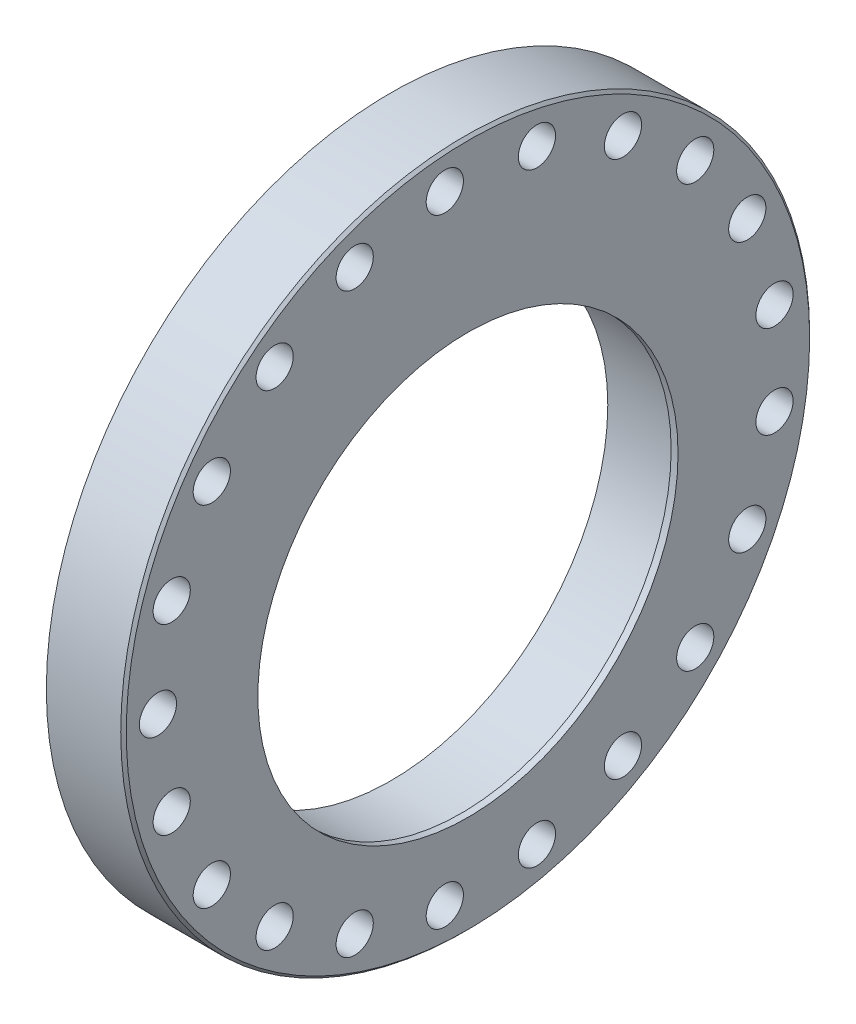
ISO-10303-21;
HEADER;
FILE_DESCRIPTION(('STEP AP214'),'2;1');
FILE_NAME('part.step','',(''),(''),'','','');
FILE_SCHEMA(('AUTOMOTIVE_DESIGN { 1 0 10303 214 1 1 1 1 }'));
ENDSEC;
DATA;
#1=APPLICATION_CONTEXT('core data for automotive mechanical design processes');
#2=APPLICATION_PROTOCOL_DEFINITION('international standard','automotive_design',2000,#1);
#3=PRODUCT_CONTEXT('',#1,'mechanical');
#4=PRODUCT('Part','Part','',(#3));
#5=PRODUCT_RELATED_PRODUCT_CATEGORY('part','',(#4));
#6=PRODUCT_DEFINITION_FORMATION('','',#4);
#7=PRODUCT_DEFINITION_CONTEXT('part definition',#1,'design');
#8=PRODUCT_DEFINITION('design','',#6,#7);
#9=PRODUCT_DEFINITION_SHAPE('','',#8);
#10=(LENGTH_UNIT() NAMED_UNIT(*) SI_UNIT(.MILLI.,.METRE.));
#11=(NAMED_UNIT(*) PLANE_ANGLE_UNIT() SI_UNIT($,.RADIAN.));
#12=(NAMED_UNIT(*) SI_UNIT($,.STERADIAN.) SOLID_ANGLE_UNIT());
#13=UNCERTAINTY_MEASURE_WITH_UNIT(LENGTH_MEASURE(1.E-05),#10,'distance_accuracy_value','');
#14=(GEOMETRIC_REPRESENTATION_CONTEXT(3) GLOBAL_UNCERTAINTY_ASSIGNED_CONTEXT((#13)) GLOBAL_UNIT_ASSIGNED_CONTEXT((#10,
#11,#12)) REPRESENTATION_CONTEXT('',''));
#15=CARTESIAN_POINT('',(0.,0.,0.));
#16=DIRECTION('',(0.,0.,1.));
#17=DIRECTION('',(1.,0.,0.));
#18=AXIS2_PLACEMENT_3D('',#15,#16,#17);
#19=CARTESIAN_POINT('',(-14.224,220.816574262267,-819.819738747229));
#20=DIRECTION('',(1.,0.,0.));
#21=DIRECTION('',(0.,0.,-1.));
#22=AXIS2_PLACEMENT_3D('',#19,#20,#21);
#23=CYLINDRICAL_SURFACE('',#22,40.);
#24=CARTESIAN_POINT('',(-14.224,220.816574262267,-819.819738747229));
#25=DIRECTION('',(1.,0.,0.));
#26=DIRECTION('',(0.,0.,-1.));
#27=AXIS2_PLACEMENT_3D('',#24,#25,#26);
#28=CIRCLE('',#27,40.);
#29=CARTESIAN_POINT('',(-14.224,220.816574262267,-859.819738747229));
#30=VERTEX_POINT('',#29);
#31=EDGE_CURVE('E71',#30,#30,#28,.T.);
#32=ORIENTED_EDGE('',*,*,#31,.F.);
#33=EDGE_LOOP('',(#32));
#34=FACE_BOUND('',#33,.T.);
#35=CARTESIAN_POINT('',(-1.27,220.816574262267,-819.819738747229));
#36=DIRECTION('',(1.,0.,0.));
#37=DIRECTION('',(0.,0.,-1.));
#38=AXIS2_PLACEMENT_3D('',#35,#36,#37);
#39=CIRCLE('',#38,40.);
#40=CARTESIAN_POINT('',(-1.27,220.816574262267,-859.819738747229));
#41=VERTEX_POINT('',#40);
#42=EDGE_CURVE('E10',#41,#41,#39,.F.);
#43=ORIENTED_EDGE('',*,*,#42,.F.);
#44=EDGE_LOOP('',(#43));
#45=FACE_BOUND('',#44,.T.);
#46=ADVANCED_FACE('F43',(#34,#45),#23,.F.);
#47=CARTESIAN_POINT('',(-14.224,227.166574262267,-819.819738747229));
#48=DIRECTION('',(1.,0.,0.));
#49=DIRECTION('',(0.,0.,-1.));
#50=AXIS2_PLACEMENT_3D('',#47,#48,#49);
#51=CYLINDRICAL_SURFACE('',#50,63.5);
#52=CARTESIAN_POINT('',(-0.508000000000022,227.166574262267,-819.819738747229));
#53=DIRECTION('',(1.,0.,0.));
#54=DIRECTION('',(0.,0.,-1.));
#55=AXIS2_PLACEMENT_3D('',#52,#53,#54);
#56=CIRCLE('',#55,63.5);
#57=CARTESIAN_POINT('',(-0.508000000000022,227.166574262267,-883.319738747229));
#58=VERTEX_POINT('',#57);
#59=EDGE_CURVE('E52',#58,#58,#56,.F.);
#60=ORIENTED_EDGE('',*,*,#59,.T.);
#61=EDGE_LOOP('',(#60));
#62=FACE_BOUND('',#61,.T.);
#63=CARTESIAN_POINT('',(-14.224,227.166574262267,-819.819738747229));
#64=DIRECTION('',(1.,0.,0.));
#65=DIRECTION('',(0.,0.,-1.));
#66=AXIS2_PLACEMENT_3D('',#63,#64,#65);
#67=CIRCLE('',#66,63.5);
#68=CARTESIAN_POINT('',(-14.224,227.166574262267,-883.319738747229));
#69=VERTEX_POINT('',#68);
#70=EDGE_CURVE('E66',#69,#69,#67,.T.);
#71=ORIENTED_EDGE('',*,*,#70,.T.);
#72=EDGE_LOOP('',(#71));
#73=FACE_BOUND('',#72,.T.);
#74=ADVANCED_FACE('F274',(#62,#73),#51,.T.);
#75=CARTESIAN_POINT('',(-14.224,227.166574262267,-819.819738747229));
#76=DIRECTION('',(1.,0.,0.));
#77=DIRECTION('',(0.,0.,-1.));
#78=AXIS2_PLACEMENT_3D('',#75,#76,#77);
#79=PLANE('',#78);
#80=CARTESIAN_POINT('',(-14.224,244.01183247985,-765.208752896551));
#81=DIRECTION('',(1.,0.,0.));
#82=DIRECTION('',(0.,0.,-1.));
#83=AXIS2_PLACEMENT_3D('',#80,#81,#82);
#84=CIRCLE('',#83,3.42899999999977);
#85=CARTESIAN_POINT('',(-14.224,244.01183247985,-768.637752896551));
#86=VERTEX_POINT('',#85);
#87=EDGE_CURVE('E231',#86,#86,#84,.T.);
#88=ORIENTED_EDGE('',*,*,#87,.T.);
#89=EDGE_LOOP('',(#88));
#90=FACE_BOUND('',#89,.T.);
#91=CARTESIAN_POINT('',(-14.224,259.360315580603,-772.60019279507));
#92=DIRECTION('',(1.,0.,0.));
#93=DIRECTION('',(0.,0.,-1.));
#94=AXIS2_PLACEMENT_3D('',#91,#92,#93);
#95=CIRCLE('',#94,3.429);
#96=CARTESIAN_POINT('',(-14.224,259.360315580603,-776.02919279507));
#97=VERTEX_POINT('',#96);
#98=EDGE_CURVE('E223',#97,#97,#95,.T.);
#99=ORIENTED_EDGE('',*,*,#98,.T.);
#100=EDGE_LOOP('',(#99));
#101=FACE_BOUND('',#100,.T.);
#102=CARTESIAN_POINT('',(-14.224,271.848243485315,-784.187296571003));
#103=DIRECTION('',(1.,0.,0.));
#104=DIRECTION('',(0.,0.,-1.));
#105=AXIS2_PLACEMENT_3D('',#102,#103,#104);
#106=CIRCLE('',#105,3.42900000000023);
#107=CARTESIAN_POINT('',(-14.224,271.848243485315,-787.616296571003));
#108=VERTEX_POINT('',#107);
#109=EDGE_CURVE('E215',#108,#108,#106,.T.);
#110=ORIENTED_EDGE('',*,*,#109,.T.);
#111=EDGE_LOOP('',(#110));
#112=FACE_BOUND('',#111,.T.);
#113=CARTESIAN_POINT('',(-14.224,280.366008997284,-798.94049920469));
#114=DIRECTION('',(1.,0.,0.));
#115=DIRECTION('',(0.,0.,-1.));
#116=AXIS2_PLACEMENT_3D('',#113,#114,#115);
#117=CIRCLE('',#116,3.429);
#118=CARTESIAN_POINT('',(-14.224,280.366008997284,-802.36949920469));
#119=VERTEX_POINT('',#118);
#120=EDGE_CURVE('E207',#119,#119,#117,.T.);
#121=ORIENTED_EDGE('',*,*,#120,.T.);
#122=EDGE_LOOP('',(#121));
#123=FACE_BOUND('',#122,.T.);
#124=CARTESIAN_POINT('',(-14.224,284.156771271172,-815.548913898765));
#125=DIRECTION('',(1.,0.,0.));
#126=DIRECTION('',(0.,0.,-1.));
#127=AXIS2_PLACEMENT_3D('',#124,#125,#126);
#128=CIRCLE('',#127,3.42899999999977);
#129=CARTESIAN_POINT('',(-14.224,284.156771271172,-818.977913898765));
#130=VERTEX_POINT('',#129);
#131=EDGE_CURVE('E199',#130,#130,#128,.T.);
#132=ORIENTED_EDGE('',*,*,#131,.T.);
#133=EDGE_LOOP('',(#132));
#134=FACE_BOUND('',#133,.T.);
#135=CARTESIAN_POINT('',(-14.224,276.659926088548,-848.394738747229));
#136=DIRECTION('',(1.,0.,0.));
#137=DIRECTION('',(0.,0.,-1.));
#138=AXIS2_PLACEMENT_3D('',#135,#136,#137);
#139=CIRCLE('',#138,3.42900000000012);
#140=CARTESIAN_POINT('',(-14.224,276.659926088548,-851.82373874723));
#141=VERTEX_POINT('',#140);
#142=EDGE_CURVE('E191',#141,#141,#139,.T.);
#143=ORIENTED_EDGE('',*,*,#142,.T.);
#144=EDGE_LOOP('',(#143));
#145=FACE_BOUND('',#144,.T.);
#146=CARTESIAN_POINT('',(-14.224,282.883704443459,-832.536810122833));
#147=DIRECTION('',(1.,0.,0.));
#148=DIRECTION('',(0.,0.,-1.));
#149=AXIS2_PLACEMENT_3D('',#146,#147,#148);
#150=CIRCLE('',#149,3.429);
#151=CARTESIAN_POINT('',(-14.224,282.883704443459,-835.965810122833));
#152=VERTEX_POINT('',#151);
#153=EDGE_CURVE('E183',#152,#152,#150,.T.);
#154=ORIENTED_EDGE('',*,*,#153,.T.);
#155=EDGE_LOOP('',(#154));
#156=FACE_BOUND('',#155,.T.);
#157=CARTESIAN_POINT('',(-14.224,266.038446225875,-861.713653222304));
#158=DIRECTION('',(1.,0.,0.));
#159=DIRECTION('',(0.,0.,-1.));
#160=AXIS2_PLACEMENT_3D('',#157,#158,#159);
#161=CIRCLE('',#160,3.42899999999989);
#162=CARTESIAN_POINT('',(-14.224,266.038446225875,-865.142653222304));
#163=VERTEX_POINT('',#162);
#164=EDGE_CURVE('E175',#163,#163,#161,.T.);
#165=ORIENTED_EDGE('',*,*,#164,.T.);
#166=EDGE_LOOP('',(#165));
#167=FACE_BOUND('',#166,.T.);
#168=CARTESIAN_POINT('',(-14.224,251.963029952836,-871.310109547853));
#169=DIRECTION('',(1.,0.,0.));
#170=DIRECTION('',(0.,0.,-1.));
#171=AXIS2_PLACEMENT_3D('',#168,#169,#170);
#172=CIRCLE('',#171,3.429);
#173=CARTESIAN_POINT('',(-14.224,251.963029952836,-874.739109547853));
#174=VERTEX_POINT('',#173);
#175=EDGE_CURVE('E167',#174,#174,#172,.T.);
#176=ORIENTED_EDGE('',*,*,#175,.T.);
#177=EDGE_LOOP('',(#176));
#178=FACE_BOUND('',#177,.T.);
#179=CARTESIAN_POINT('',(-14.224,218.648808750299,-876.331420465995));
#180=DIRECTION('',(1.,0.,0.));
#181=DIRECTION('',(0.,0.,-1.));
#182=AXIS2_PLACEMENT_3D('',#179,#180,#181);
#183=CIRCLE('',#182,3.42899999999977);
#184=CARTESIAN_POINT('',(-14.224,218.648808750299,-879.760420465995));
#185=VERTEX_POINT('',#184);
#186=EDGE_CURVE('E159',#185,#185,#183,.T.);
#187=ORIENTED_EDGE('',*,*,#186,.T.);
#188=EDGE_LOOP('',(#187));
#189=FACE_BOUND('',#188,.T.);
#190=CARTESIAN_POINT('',(-14.224,235.684339774236,-876.331420465996));
#191=DIRECTION('',(1.,0.,0.));
#192=DIRECTION('',(0.,0.,-1.));
#193=AXIS2_PLACEMENT_3D('',#190,#191,#192);
#194=CIRCLE('',#193,3.42899999999988);
#195=CARTESIAN_POINT('',(-14.224,235.684339774236,-879.760420465996));
#196=VERTEX_POINT('',#195);
#197=EDGE_CURVE('E151',#196,#196,#194,.T.);
#198=ORIENTED_EDGE('',*,*,#197,.T.);
#199=EDGE_LOOP('',(#198));
#200=FACE_BOUND('',#199,.T.);
#201=CARTESIAN_POINT('',(-14.224,177.673222435986,-848.394738747229));
#202=DIRECTION('',(1.,0.,0.));
#203=DIRECTION('',(0.,0.,-1.));
#204=AXIS2_PLACEMENT_3D('',#201,#202,#203);
#205=CIRCLE('',#204,3.429);
#206=CARTESIAN_POINT('',(-14.224,177.673222435986,-851.823738747229));
#207=VERTEX_POINT('',#206);
#208=EDGE_CURVE('E143',#207,#207,#205,.T.);
#209=ORIENTED_EDGE('',*,*,#208,.T.);
#210=EDGE_LOOP('',(#209));
#211=FACE_BOUND('',#210,.T.);
#212=CARTESIAN_POINT('',(-14.224,171.449444081076,-832.536810122833));
#213=DIRECTION('',(1.,0.,0.));
#214=DIRECTION('',(0.,0.,-1.));
#215=AXIS2_PLACEMENT_3D('',#212,#213,#214);
#216=CIRCLE('',#215,3.429);
#217=CARTESIAN_POINT('',(-14.224,171.449444081076,-835.965810122833));
#218=VERTEX_POINT('',#217);
#219=EDGE_CURVE('E135',#218,#218,#216,.T.);
#220=ORIENTED_EDGE('',*,*,#219,.T.);
#221=EDGE_LOOP('',(#220));
#222=FACE_BOUND('',#221,.T.);
#223=CARTESIAN_POINT('',(-14.224,170.176377253363,-815.548913898765));
#224=DIRECTION('',(1.,0.,0.));
#225=DIRECTION('',(0.,0.,-1.));
#226=AXIS2_PLACEMENT_3D('',#223,#224,#225);
#227=CIRCLE('',#226,3.42899999999988);
#228=CARTESIAN_POINT('',(-14.224,170.176377253363,-818.977913898765));
#229=VERTEX_POINT('',#228);
#230=EDGE_CURVE('E127',#229,#229,#227,.T.);
#231=ORIENTED_EDGE('',*,*,#230,.T.);
#232=EDGE_LOOP('',(#231));
#233=FACE_BOUND('',#232,.T.);
#234=CARTESIAN_POINT('',(-14.224,173.967139527251,-798.94049920469));
#235=DIRECTION('',(1.,0.,0.));
#236=DIRECTION('',(0.,0.,-1.));
#237=AXIS2_PLACEMENT_3D('',#234,#235,#236);
#238=CIRCLE('',#237,3.42899999999988);
#239=CARTESIAN_POINT('',(-14.224,173.967139527251,-802.36949920469));
#240=VERTEX_POINT('',#239);
#241=EDGE_CURVE('E119',#240,#240,#238,.T.);
#242=ORIENTED_EDGE('',*,*,#241,.T.);
#243=EDGE_LOOP('',(#242));
#244=FACE_BOUND('',#243,.T.);
#245=CARTESIAN_POINT('',(-14.224,210.321316044684,-765.208752896551));
#246=DIRECTION('',(1.,0.,0.));
#247=DIRECTION('',(0.,0.,-1.));
#248=AXIS2_PLACEMENT_3D('',#245,#246,#247);
#249=CIRCLE('',#248,3.42900000000012);
#250=CARTESIAN_POINT('',(-14.224,210.321316044684,-768.637752896551));
#251=VERTEX_POINT('',#250);
#252=EDGE_CURVE('E111',#251,#251,#249,.T.);
#253=ORIENTED_EDGE('',*,*,#252,.T.);
#254=EDGE_LOOP('',(#253));
#255=FACE_BOUND('',#254,.T.);
#256=CARTESIAN_POINT('',(-14.224,182.484905039219,-784.187296571003));
#257=DIRECTION('',(1.,0.,0.));
#258=DIRECTION('',(0.,0.,-1.));
#259=AXIS2_PLACEMENT_3D('',#256,#257,#258);
#260=CIRCLE('',#259,3.42899999999988);
#261=CARTESIAN_POINT('',(-14.224,182.484905039219,-787.616296571003));
#262=VERTEX_POINT('',#261);
#263=EDGE_CURVE('E103',#262,#262,#260,.T.);
#264=ORIENTED_EDGE('',*,*,#263,.T.);
#265=EDGE_LOOP('',(#264));
#266=FACE_BOUND('',#265,.T.);
#267=CARTESIAN_POINT('',(-14.224,194.972832943931,-772.60019279507));
#268=DIRECTION('',(1.,0.,0.));
#269=DIRECTION('',(0.,0.,-1.));
#270=AXIS2_PLACEMENT_3D('',#267,#268,#269);
#271=CIRCLE('',#270,3.429);
#272=CARTESIAN_POINT('',(-14.224,194.972832943931,-776.02919279507));
#273=VERTEX_POINT('',#272);
#274=EDGE_CURVE('E95',#273,#273,#271,.T.);
#275=ORIENTED_EDGE('',*,*,#274,.T.);
#276=EDGE_LOOP('',(#275));
#277=FACE_BOUND('',#276,.T.);
#278=CARTESIAN_POINT('',(-14.224,227.166574262267,-762.669738747229));
#279=DIRECTION('',(1.,0.,0.));
#280=DIRECTION('',(0.,0.,-1.));
#281=AXIS2_PLACEMENT_3D('',#278,#279,#280);
#282=CIRCLE('',#281,3.429);
#283=CARTESIAN_POINT('',(-14.224,227.166574262267,-766.098738747229));
#284=VERTEX_POINT('',#283);
#285=EDGE_CURVE('E87',#284,#284,#282,.T.);
#286=ORIENTED_EDGE('',*,*,#285,.T.);
#287=EDGE_LOOP('',(#286));
#288=FACE_BOUND('',#287,.T.);
#289=CARTESIAN_POINT('',(-14.224,188.294702298659,-861.713653222304));
#290=DIRECTION('',(1.,0.,0.));
#291=DIRECTION('',(0.,0.,-1.));
#292=AXIS2_PLACEMENT_3D('',#289,#290,#291);
#293=CIRCLE('',#292,3.42900000000012);
#294=CARTESIAN_POINT('',(-14.224,188.294702298659,-865.142653222304));
#295=VERTEX_POINT('',#294);
#296=EDGE_CURVE('E79',#295,#295,#293,.T.);
#297=ORIENTED_EDGE('',*,*,#296,.T.);
#298=EDGE_LOOP('',(#297));
#299=FACE_BOUND('',#298,.T.);
#300=CARTESIAN_POINT('',(-14.224,202.370118571699,-871.310109547852));
#301=DIRECTION('',(1.,0.,0.));
#302=DIRECTION('',(0.,0.,-1.));
#303=AXIS2_PLACEMENT_3D('',#300,#301,#302);
#304=CIRCLE('',#303,3.42900000000012);
#305=CARTESIAN_POINT('',(-14.224,202.370118571699,-874.739109547853));
#306=VERTEX_POINT('',#305);
#307=EDGE_CURVE('E74',#306,#306,#304,.T.);
#308=ORIENTED_EDGE('',*,*,#307,.T.);
#309=EDGE_LOOP('',(#308));
#310=FACE_BOUND('',#309,.T.);
#311=ORIENTED_EDGE('',*,*,#31,.T.);
#312=EDGE_LOOP('',(#311));
#313=FACE_BOUND('',#312,.T.);
#314=ORIENTED_EDGE('',*,*,#70,.F.);
#315=EDGE_LOOP('',(#314));
#316=FACE_BOUND('',#315,.T.);
#317=ADVANCED_FACE('F263',(#90,#101,#112,#123,#134,#145,#156,#167,#178,#189,#200,#211,#222,#233,
#244,#255,#266,#277,#288,#299,#310,#313,#316),#79,.F.);
#318=CARTESIAN_POINT('',(0.,227.166574262267,-819.819738747229));
#319=DIRECTION('',(1.,0.,0.));
#320=DIRECTION('',(0.,0.,-1.));
#321=AXIS2_PLACEMENT_3D('',#318,#319,#320);
#322=PLANE('',#321);
#323=CARTESIAN_POINT('',(0.,227.166574262267,-819.819738747229));
#324=DIRECTION('',(1.,0.,0.));
#325=DIRECTION('',(0.,0.,-1.));
#326=AXIS2_PLACEMENT_3D('',#323,#324,#325);
#327=CIRCLE('',#326,62.9919999999999);
#328=CARTESIAN_POINT('',(0.,227.166574262267,-882.811738747229));
#329=VERTEX_POINT('',#328);
#330=EDGE_CURVE('E59',#329,#329,#327,.T.);
#331=ORIENTED_EDGE('',*,*,#330,.T.);
#332=EDGE_LOOP('',(#331));
#333=FACE_BOUND('',#332,.T.);
#334=CARTESIAN_POINT('',(0.,244.01183247985,-765.208752896551));
#335=DIRECTION('',(1.,0.,0.));
#336=DIRECTION('',(0.,0.,-1.));
#337=AXIS2_PLACEMENT_3D('',#334,#335,#336);
#338=CIRCLE('',#337,3.42899999999977);
#339=CARTESIAN_POINT('',(0.,244.01183247985,-768.637752896551));
#340=VERTEX_POINT('',#339);
#341=EDGE_CURVE('E235',#340,#340,#338,.T.);
#342=ORIENTED_EDGE('',*,*,#341,.F.);
#343=EDGE_LOOP('',(#342));
#344=FACE_BOUND('',#343,.T.);
#345=CARTESIAN_POINT('',(0.,259.360315580603,-772.60019279507));
#346=DIRECTION('',(1.,0.,0.));
#347=DIRECTION('',(0.,0.,-1.));
#348=AXIS2_PLACEMENT_3D('',#345,#346,#347);
#349=CIRCLE('',#348,3.429);
#350=CARTESIAN_POINT('',(0.,259.360315580603,-776.02919279507));
#351=VERTEX_POINT('',#350);
#352=EDGE_CURVE('E227',#351,#351,#349,.T.);
#353=ORIENTED_EDGE('',*,*,#352,.F.);
#354=EDGE_LOOP('',(#353));
#355=FACE_BOUND('',#354,.T.);
#356=CARTESIAN_POINT('',(0.,271.848243485315,-784.187296571003));
#357=DIRECTION('',(1.,0.,0.));
#358=DIRECTION('',(0.,0.,-1.));
#359=AXIS2_PLACEMENT_3D('',#356,#357,#358);
#360=CIRCLE('',#359,3.42900000000023);
#361=CARTESIAN_POINT('',(0.,271.848243485315,-787.616296571003));
#362=VERTEX_POINT('',#361);
#363=EDGE_CURVE('E219',#362,#362,#360,.T.);
#364=ORIENTED_EDGE('',*,*,#363,.F.);
#365=EDGE_LOOP('',(#364));
#366=FACE_BOUND('',#365,.T.);
#367=CARTESIAN_POINT('',(0.,280.366008997284,-798.94049920469));
#368=DIRECTION('',(1.,0.,0.));
#369=DIRECTION('',(0.,0.,-1.));
#370=AXIS2_PLACEMENT_3D('',#367,#368,#369);
#371=CIRCLE('',#370,3.429);
#372=CARTESIAN_POINT('',(0.,280.366008997284,-802.36949920469));
#373=VERTEX_POINT('',#372);
#374=EDGE_CURVE('E211',#373,#373,#371,.T.);
#375=ORIENTED_EDGE('',*,*,#374,.F.);
#376=EDGE_LOOP('',(#375));
#377=FACE_BOUND('',#376,.T.);
#378=CARTESIAN_POINT('',(0.,284.156771271172,-815.548913898765));
#379=DIRECTION('',(1.,0.,0.));
#380=DIRECTION('',(0.,0.,-1.));
#381=AXIS2_PLACEMENT_3D('',#378,#379,#380);
#382=CIRCLE('',#381,3.42899999999977);
#383=CARTESIAN_POINT('',(0.,284.156771271172,-818.977913898765));
#384=VERTEX_POINT('',#383);
#385=EDGE_CURVE('E203',#384,#384,#382,.T.);
#386=ORIENTED_EDGE('',*,*,#385,.F.);
#387=EDGE_LOOP('',(#386));
#388=FACE_BOUND('',#387,.T.);
#389=CARTESIAN_POINT('',(0.,276.659926088548,-848.394738747229));
#390=DIRECTION('',(1.,0.,0.));
#391=DIRECTION('',(0.,0.,-1.));
#392=AXIS2_PLACEMENT_3D('',#389,#390,#391);
#393=CIRCLE('',#392,3.42900000000012);
#394=CARTESIAN_POINT('',(0.,276.659926088548,-851.82373874723));
#395=VERTEX_POINT('',#394);
#396=EDGE_CURVE('E195',#395,#395,#393,.T.);
#397=ORIENTED_EDGE('',*,*,#396,.F.);
#398=EDGE_LOOP('',(#397));
#399=FACE_BOUND('',#398,.T.);
#400=CARTESIAN_POINT('',(0.,282.883704443459,-832.536810122833));
#401=DIRECTION('',(1.,0.,0.));
#402=DIRECTION('',(0.,0.,-1.));
#403=AXIS2_PLACEMENT_3D('',#400,#401,#402);
#404=CIRCLE('',#403,3.429);
#405=CARTESIAN_POINT('',(0.,282.883704443459,-835.965810122833));
#406=VERTEX_POINT('',#405);
#407=EDGE_CURVE('E187',#406,#406,#404,.T.);
#408=ORIENTED_EDGE('',*,*,#407,.F.);
#409=EDGE_LOOP('',(#408));
#410=FACE_BOUND('',#409,.T.);
#411=CARTESIAN_POINT('',(0.,266.038446225875,-861.713653222304));
#412=DIRECTION('',(1.,0.,0.));
#413=DIRECTION('',(0.,0.,-1.));
#414=AXIS2_PLACEMENT_3D('',#411,#412,#413);
#415=CIRCLE('',#414,3.42899999999989);
#416=CARTESIAN_POINT('',(0.,266.038446225875,-865.142653222304));
#417=VERTEX_POINT('',#416);
#418=EDGE_CURVE('E179',#417,#417,#415,.T.);
#419=ORIENTED_EDGE('',*,*,#418,.F.);
#420=EDGE_LOOP('',(#419));
#421=FACE_BOUND('',#420,.T.);
#422=CARTESIAN_POINT('',(0.,251.963029952836,-871.310109547853));
#423=DIRECTION('',(1.,0.,0.));
#424=DIRECTION('',(0.,0.,-1.));
#425=AXIS2_PLACEMENT_3D('',#422,#423,#424);
#426=CIRCLE('',#425,3.429);
#427=CARTESIAN_POINT('',(0.,251.963029952836,-874.739109547853));
#428=VERTEX_POINT('',#427);
#429=EDGE_CURVE('E171',#428,#428,#426,.T.);
#430=ORIENTED_EDGE('',*,*,#429,.F.);
#431=EDGE_LOOP('',(#430));
#432=FACE_BOUND('',#431,.T.);
#433=CARTESIAN_POINT('',(0.,218.648808750299,-876.331420465995));
#434=DIRECTION('',(1.,0.,0.));
#435=DIRECTION('',(0.,0.,-1.));
#436=AXIS2_PLACEMENT_3D('',#433,#434,#435);
#437=CIRCLE('',#436,3.42899999999977);
#438=CARTESIAN_POINT('',(0.,218.648808750299,-879.760420465995));
#439=VERTEX_POINT('',#438);
#440=EDGE_CURVE('E163',#439,#439,#437,.T.);
#441=ORIENTED_EDGE('',*,*,#440,.F.);
#442=EDGE_LOOP('',(#441));
#443=FACE_BOUND('',#442,.T.);
#444=CARTESIAN_POINT('',(0.,235.684339774236,-876.331420465996));
#445=DIRECTION('',(1.,0.,0.));
#446=DIRECTION('',(0.,0.,-1.));
#447=AXIS2_PLACEMENT_3D('',#444,#445,#446);
#448=CIRCLE('',#447,3.42899999999988);
#449=CARTESIAN_POINT('',(0.,235.684339774236,-879.760420465996));
#450=VERTEX_POINT('',#449);
#451=EDGE_CURVE('E155',#450,#450,#448,.T.);
#452=ORIENTED_EDGE('',*,*,#451,.F.);
#453=EDGE_LOOP('',(#452));
#454=FACE_BOUND('',#453,.T.);
#455=CARTESIAN_POINT('',(0.,177.673222435986,-848.394738747229));
#456=DIRECTION('',(1.,0.,0.));
#457=DIRECTION('',(0.,0.,-1.));
#458=AXIS2_PLACEMENT_3D('',#455,#456,#457);
#459=CIRCLE('',#458,3.429);
#460=CARTESIAN_POINT('',(0.,177.673222435986,-851.823738747229));
#461=VERTEX_POINT('',#460);
#462=EDGE_CURVE('E147',#461,#461,#459,.T.);
#463=ORIENTED_EDGE('',*,*,#462,.F.);
#464=EDGE_LOOP('',(#463));
#465=FACE_BOUND('',#464,.T.);
#466=CARTESIAN_POINT('',(0.,171.449444081076,-832.536810122833));
#467=DIRECTION('',(1.,0.,0.));
#468=DIRECTION('',(0.,0.,-1.));
#469=AXIS2_PLACEMENT_3D('',#466,#467,#468);
#470=CIRCLE('',#469,3.429);
#471=CARTESIAN_POINT('',(0.,171.449444081076,-835.965810122833));
#472=VERTEX_POINT('',#471);
#473=EDGE_CURVE('E139',#472,#472,#470,.T.);
#474=ORIENTED_EDGE('',*,*,#473,.F.);
#475=EDGE_LOOP('',(#474));
#476=FACE_BOUND('',#475,.T.);
#477=CARTESIAN_POINT('',(0.,170.176377253363,-815.548913898765));
#478=DIRECTION('',(1.,0.,0.));
#479=DIRECTION('',(0.,0.,-1.));
#480=AXIS2_PLACEMENT_3D('',#477,#478,#479);
#481=CIRCLE('',#480,3.42899999999988);
#482=CARTESIAN_POINT('',(0.,170.176377253363,-818.977913898765));
#483=VERTEX_POINT('',#482);
#484=EDGE_CURVE('E131',#483,#483,#481,.T.);
#485=ORIENTED_EDGE('',*,*,#484,.F.);
#486=EDGE_LOOP('',(#485));
#487=FACE_BOUND('',#486,.T.);
#488=CARTESIAN_POINT('',(0.,173.967139527251,-798.94049920469));
#489=DIRECTION('',(1.,0.,0.));
#490=DIRECTION('',(0.,0.,-1.));
#491=AXIS2_PLACEMENT_3D('',#488,#489,#490);
#492=CIRCLE('',#491,3.42899999999988);
#493=CARTESIAN_POINT('',(0.,173.967139527251,-802.36949920469));
#494=VERTEX_POINT('',#493);
#495=EDGE_CURVE('E123',#494,#494,#492,.T.);
#496=ORIENTED_EDGE('',*,*,#495,.F.);
#497=EDGE_LOOP('',(#496));
#498=FACE_BOUND('',#497,.T.);
#499=CARTESIAN_POINT('',(0.,210.321316044684,-765.208752896551));
#500=DIRECTION('',(1.,0.,0.));
#501=DIRECTION('',(0.,0.,-1.));
#502=AXIS2_PLACEMENT_3D('',#499,#500,#501);
#503=CIRCLE('',#502,3.42900000000012);
#504=CARTESIAN_POINT('',(0.,210.321316044684,-768.637752896551));
#505=VERTEX_POINT('',#504);
#506=EDGE_CURVE('E115',#505,#505,#503,.T.);
#507=ORIENTED_EDGE('',*,*,#506,.F.);
#508=EDGE_LOOP('',(#507));
#509=FACE_BOUND('',#508,.T.);
#510=CARTESIAN_POINT('',(0.,182.484905039219,-784.187296571003));
#511=DIRECTION('',(1.,0.,0.));
#512=DIRECTION('',(0.,0.,-1.));
#513=AXIS2_PLACEMENT_3D('',#510,#511,#512);
#514=CIRCLE('',#513,3.42899999999988);
#515=CARTESIAN_POINT('',(0.,182.484905039219,-787.616296571003));
#516=VERTEX_POINT('',#515);
#517=EDGE_CURVE('E107',#516,#516,#514,.T.);
#518=ORIENTED_EDGE('',*,*,#517,.F.);
#519=EDGE_LOOP('',(#518));
#520=FACE_BOUND('',#519,.T.);
#521=CARTESIAN_POINT('',(0.,194.972832943931,-772.60019279507));
#522=DIRECTION('',(1.,0.,0.));
#523=DIRECTION('',(0.,0.,-1.));
#524=AXIS2_PLACEMENT_3D('',#521,#522,#523);
#525=CIRCLE('',#524,3.429);
#526=CARTESIAN_POINT('',(0.,194.972832943931,-776.02919279507));
#527=VERTEX_POINT('',#526);
#528=EDGE_CURVE('E99',#527,#527,#525,.T.);
#529=ORIENTED_EDGE('',*,*,#528,.F.);
#530=EDGE_LOOP('',(#529));
#531=FACE_BOUND('',#530,.T.);
#532=CARTESIAN_POINT('',(0.,227.166574262267,-762.669738747229));
#533=DIRECTION('',(1.,0.,0.));
#534=DIRECTION('',(0.,0.,-1.));
#535=AXIS2_PLACEMENT_3D('',#532,#533,#534);
#536=CIRCLE('',#535,3.429);
#537=CARTESIAN_POINT('',(0.,227.166574262267,-766.098738747229));
#538=VERTEX_POINT('',#537);
#539=EDGE_CURVE('E91',#538,#538,#536,.T.);
#540=ORIENTED_EDGE('',*,*,#539,.F.);
#541=EDGE_LOOP('',(#540));
#542=FACE_BOUND('',#541,.T.);
#543=CARTESIAN_POINT('',(0.,188.294702298659,-861.713653222304));
#544=DIRECTION('',(1.,0.,0.));
#545=DIRECTION('',(0.,0.,-1.));
#546=AXIS2_PLACEMENT_3D('',#543,#544,#545);
#547=CIRCLE('',#546,3.42900000000012);
#548=CARTESIAN_POINT('',(0.,188.294702298659,-865.142653222304));
#549=VERTEX_POINT('',#548);
#550=EDGE_CURVE('E83',#549,#549,#547,.T.);
#551=ORIENTED_EDGE('',*,*,#550,.F.);
#552=EDGE_LOOP('',(#551));
#553=FACE_BOUND('',#552,.T.);
#554=CARTESIAN_POINT('',(0.,202.370118571699,-871.310109547852));
#555=DIRECTION('',(1.,0.,0.));
#556=DIRECTION('',(0.,0.,-1.));
#557=AXIS2_PLACEMENT_3D('',#554,#555,#556);
#558=CIRCLE('',#557,3.42900000000012);
#559=CARTESIAN_POINT('',(0.,202.370118571699,-874.739109547853));
#560=VERTEX_POINT('',#559);
#561=EDGE_CURVE('E75',#560,#560,#558,.T.);
#562=ORIENTED_EDGE('',*,*,#561,.F.);
#563=EDGE_LOOP('',(#562));
#564=FACE_BOUND('',#563,.T.);
#565=CARTESIAN_POINT('',(0.,220.816574262267,-819.819738747229));
#566=DIRECTION('',(1.,0.,0.));
#567=DIRECTION('',(0.,0.,-1.));
#568=AXIS2_PLACEMENT_3D('',#565,#566,#567);
#569=CIRCLE('',#568,38.73);
#570=CARTESIAN_POINT('',(0.,220.816574262267,-858.549738747229));
#571=VERTEX_POINT('',#570);
#572=EDGE_CURVE('E243',#571,#571,#569,.T.);
#573=ORIENTED_EDGE('',*,*,#572,.F.);
#574=EDGE_LOOP('',(#573));
#575=FACE_BOUND('',#574,.T.);
#576=ADVANCED_FACE('F260',(#333,#344,#355,#366,#377,#388,#399,#410,#421,#432,#443,#454,#465,
#476,#487,#498,#509,#520,#531,#542,#553,#564,#575),#322,.T.);
#577=CARTESIAN_POINT('',(-14.224,202.370118571699,-871.310109547852));
#578=DIRECTION('',(1.,0.,0.));
#579=DIRECTION('',(0.,0.,-1.));
#580=AXIS2_PLACEMENT_3D('',#577,#578,#579);
#581=CYLINDRICAL_SURFACE('',#580,3.42900000000012);
#582=ORIENTED_EDGE('',*,*,#307,.F.);
#583=EDGE_LOOP('',(#582));
#584=FACE_BOUND('',#583,.T.);
#585=ORIENTED_EDGE('',*,*,#561,.T.);
#586=EDGE_LOOP('',(#585));
#587=FACE_BOUND('',#586,.T.);
#588=ADVANCED_FACE('F262',(#584,#587),#581,.F.);
#589=CARTESIAN_POINT('',(-14.224,188.294702298659,-861.713653222304));
#590=DIRECTION('',(1.,0.,0.));
#591=DIRECTION('',(0.,0.,-1.));
#592=AXIS2_PLACEMENT_3D('',#589,#590,#591);
#593=CYLINDRICAL_SURFACE('',#592,3.42900000000012);
#594=ORIENTED_EDGE('',*,*,#296,.F.);
#595=EDGE_LOOP('',(#594));
#596=FACE_BOUND('',#595,.T.);
#597=ORIENTED_EDGE('',*,*,#550,.T.);
#598=EDGE_LOOP('',(#597));
#599=FACE_BOUND('',#598,.T.);
#600=ADVANCED_FACE('F270',(#596,#599),#593,.F.);
#601=CARTESIAN_POINT('',(-14.224,227.166574262267,-762.669738747229));
#602=DIRECTION('',(1.,0.,0.));
#603=DIRECTION('',(0.,0.,-1.));
#604=AXIS2_PLACEMENT_3D('',#601,#602,#603);
#605=CYLINDRICAL_SURFACE('',#604,3.429);
#606=ORIENTED_EDGE('',*,*,#285,.F.);
#607=EDGE_LOOP('',(#606));
#608=FACE_BOUND('',#607,.T.);
#609=ORIENTED_EDGE('',*,*,#539,.T.);
#610=EDGE_LOOP('',(#609));
#611=FACE_BOUND('',#610,.T.);
#612=ADVANCED_FACE('F290',(#608,#611),#605,.F.);
#613=CARTESIAN_POINT('',(-14.224,194.972832943931,-772.60019279507));
#614=DIRECTION('',(1.,0.,0.));
#615=DIRECTION('',(0.,0.,-1.));
#616=AXIS2_PLACEMENT_3D('',#613,#614,#615);
#617=CYLINDRICAL_SURFACE('',#616,3.429);
#618=ORIENTED_EDGE('',*,*,#274,.F.);
#619=EDGE_LOOP('',(#618));
#620=FACE_BOUND('',#619,.T.);
#621=ORIENTED_EDGE('',*,*,#528,.T.);
#622=EDGE_LOOP('',(#621));
#623=FACE_BOUND('',#622,.T.);
#624=ADVANCED_FACE('F294',(#620,#623),#617,.F.);
#625=CARTESIAN_POINT('',(-14.224,182.484905039219,-784.187296571003));
#626=DIRECTION('',(1.,0.,0.));
#627=DIRECTION('',(0.,0.,-1.));
#628=AXIS2_PLACEMENT_3D('',#625,#626,#627);
#629=CYLINDRICAL_SURFACE('',#628,3.42899999999988);
#630=ORIENTED_EDGE('',*,*,#263,.F.);
#631=EDGE_LOOP('',(#630));
#632=FACE_BOUND('',#631,.T.);
#633=ORIENTED_EDGE('',*,*,#517,.T.);
#634=EDGE_LOOP('',(#633));
#635=FACE_BOUND('',#634,.T.);
#636=ADVANCED_FACE('F298',(#632,#635),#629,.F.);
#637=CARTESIAN_POINT('',(-14.224,210.321316044684,-765.208752896551));
#638=DIRECTION('',(1.,0.,0.));
#639=DIRECTION('',(0.,0.,-1.));
#640=AXIS2_PLACEMENT_3D('',#637,#638,#639);
#641=CYLINDRICAL_SURFACE('',#640,3.42900000000012);
#642=ORIENTED_EDGE('',*,*,#252,.F.);
#643=EDGE_LOOP('',(#642));
#644=FACE_BOUND('',#643,.T.);
#645=ORIENTED_EDGE('',*,*,#506,.T.);
#646=EDGE_LOOP('',(#645));
#647=FACE_BOUND('',#646,.T.);
#648=ADVANCED_FACE('F302',(#644,#647),#641,.F.);
#649=CARTESIAN_POINT('',(-14.224,173.967139527251,-798.94049920469));
#650=DIRECTION('',(1.,0.,0.));
#651=DIRECTION('',(0.,0.,-1.));
#652=AXIS2_PLACEMENT_3D('',#649,#650,#651);
#653=CYLINDRICAL_SURFACE('',#652,3.42899999999988);
#654=ORIENTED_EDGE('',*,*,#241,.F.);
#655=EDGE_LOOP('',(#654));
#656=FACE_BOUND('',#655,.T.);
#657=ORIENTED_EDGE('',*,*,#495,.T.);
#658=EDGE_LOOP('',(#657));
#659=FACE_BOUND('',#658,.T.);
#660=ADVANCED_FACE('F306',(#656,#659),#653,.F.);
#661=CARTESIAN_POINT('',(-14.224,170.176377253363,-815.548913898765));
#662=DIRECTION('',(1.,0.,0.));
#663=DIRECTION('',(0.,0.,-1.));
#664=AXIS2_PLACEMENT_3D('',#661,#662,#663);
#665=CYLINDRICAL_SURFACE('',#664,3.42899999999988);
#666=ORIENTED_EDGE('',*,*,#230,.F.);
#667=EDGE_LOOP('',(#666));
#668=FACE_BOUND('',#667,.T.);
#669=ORIENTED_EDGE('',*,*,#484,.T.);
#670=EDGE_LOOP('',(#669));
#671=FACE_BOUND('',#670,.T.);
#672=ADVANCED_FACE('F310',(#668,#671),#665,.F.);
#673=CARTESIAN_POINT('',(-14.224,171.449444081076,-832.536810122833));
#674=DIRECTION('',(1.,0.,0.));
#675=DIRECTION('',(0.,0.,-1.));
#676=AXIS2_PLACEMENT_3D('',#673,#674,#675);
#677=CYLINDRICAL_SURFACE('',#676,3.429);
#678=ORIENTED_EDGE('',*,*,#219,.F.);
#679=EDGE_LOOP('',(#678));
#680=FACE_BOUND('',#679,.T.);
#681=ORIENTED_EDGE('',*,*,#473,.T.);
#682=EDGE_LOOP('',(#681));
#683=FACE_BOUND('',#682,.T.);
#684=ADVANCED_FACE('F314',(#680,#683),#677,.F.);
#685=CARTESIAN_POINT('',(-14.224,177.673222435986,-848.394738747229));
#686=DIRECTION('',(1.,0.,0.));
#687=DIRECTION('',(0.,0.,-1.));
#688=AXIS2_PLACEMENT_3D('',#685,#686,#687);
#689=CYLINDRICAL_SURFACE('',#688,3.429);
#690=ORIENTED_EDGE('',*,*,#208,.F.);
#691=EDGE_LOOP('',(#690));
#692=FACE_BOUND('',#691,.T.);
#693=ORIENTED_EDGE('',*,*,#462,.T.);
#694=EDGE_LOOP('',(#693));
#695=FACE_BOUND('',#694,.T.);
#696=ADVANCED_FACE('F318',(#692,#695),#689,.F.);
#697=CARTESIAN_POINT('',(-14.224,235.684339774236,-876.331420465996));
#698=DIRECTION('',(1.,0.,0.));
#699=DIRECTION('',(0.,0.,-1.));
#700=AXIS2_PLACEMENT_3D('',#697,#698,#699);
#701=CYLINDRICAL_SURFACE('',#700,3.42899999999988);
#702=ORIENTED_EDGE('',*,*,#197,.F.);
#703=EDGE_LOOP('',(#702));
#704=FACE_BOUND('',#703,.T.);
#705=ORIENTED_EDGE('',*,*,#451,.T.);
#706=EDGE_LOOP('',(#705));
#707=FACE_BOUND('',#706,.T.);
#708=ADVANCED_FACE('F322',(#704,#707),#701,.F.);
#709=CARTESIAN_POINT('',(-14.224,218.648808750299,-876.331420465995));
#710=DIRECTION('',(1.,0.,0.));
#711=DIRECTION('',(0.,0.,-1.));
#712=AXIS2_PLACEMENT_3D('',#709,#710,#711);
#713=CYLINDRICAL_SURFACE('',#712,3.42899999999977);
#714=ORIENTED_EDGE('',*,*,#186,.F.);
#715=EDGE_LOOP('',(#714));
#716=FACE_BOUND('',#715,.T.);
#717=ORIENTED_EDGE('',*,*,#440,.T.);
#718=EDGE_LOOP('',(#717));
#719=FACE_BOUND('',#718,.T.);
#720=ADVANCED_FACE('F326',(#716,#719),#713,.F.);
#721=CARTESIAN_POINT('',(-14.224,251.963029952836,-871.310109547853));
#722=DIRECTION('',(1.,0.,0.));
#723=DIRECTION('',(0.,0.,-1.));
#724=AXIS2_PLACEMENT_3D('',#721,#722,#723);
#725=CYLINDRICAL_SURFACE('',#724,3.429);
#726=ORIENTED_EDGE('',*,*,#175,.F.);
#727=EDGE_LOOP('',(#726));
#728=FACE_BOUND('',#727,.T.);
#729=ORIENTED_EDGE('',*,*,#429,.T.);
#730=EDGE_LOOP('',(#729));
#731=FACE_BOUND('',#730,.T.);
#732=ADVANCED_FACE('F330',(#728,#731),#725,.F.);
#733=CARTESIAN_POINT('',(-14.224,266.038446225875,-861.713653222304));
#734=DIRECTION('',(1.,0.,0.));
#735=DIRECTION('',(0.,0.,-1.));
#736=AXIS2_PLACEMENT_3D('',#733,#734,#735);
#737=CYLINDRICAL_SURFACE('',#736,3.42899999999989);
#738=ORIENTED_EDGE('',*,*,#164,.F.);
#739=EDGE_LOOP('',(#738));
#740=FACE_BOUND('',#739,.T.);
#741=ORIENTED_EDGE('',*,*,#418,.T.);
#742=EDGE_LOOP('',(#741));
#743=FACE_BOUND('',#742,.T.);
#744=ADVANCED_FACE('F334',(#740,#743),#737,.F.);
#745=CARTESIAN_POINT('',(-14.224,282.883704443459,-832.536810122833));
#746=DIRECTION('',(1.,0.,0.));
#747=DIRECTION('',(0.,0.,-1.));
#748=AXIS2_PLACEMENT_3D('',#745,#746,#747);
#749=CYLINDRICAL_SURFACE('',#748,3.429);
#750=ORIENTED_EDGE('',*,*,#153,.F.);
#751=EDGE_LOOP('',(#750));
#752=FACE_BOUND('',#751,.T.);
#753=ORIENTED_EDGE('',*,*,#407,.T.);
#754=EDGE_LOOP('',(#753));
#755=FACE_BOUND('',#754,.T.);
#756=ADVANCED_FACE('F338',(#752,#755),#749,.F.);
#757=CARTESIAN_POINT('',(-14.224,276.659926088548,-848.394738747229));
#758=DIRECTION('',(1.,0.,0.));
#759=DIRECTION('',(0.,0.,-1.));
#760=AXIS2_PLACEMENT_3D('',#757,#758,#759);
#761=CYLINDRICAL_SURFACE('',#760,3.42900000000012);
#762=ORIENTED_EDGE('',*,*,#142,.F.);
#763=EDGE_LOOP('',(#762));
#764=FACE_BOUND('',#763,.T.);
#765=ORIENTED_EDGE('',*,*,#396,.T.);
#766=EDGE_LOOP('',(#765));
#767=FACE_BOUND('',#766,.T.);
#768=ADVANCED_FACE('F342',(#764,#767),#761,.F.);
#769=CARTESIAN_POINT('',(-14.224,284.156771271172,-815.548913898765));
#770=DIRECTION('',(1.,0.,0.));
#771=DIRECTION('',(0.,0.,-1.));
#772=AXIS2_PLACEMENT_3D('',#769,#770,#771);
#773=CYLINDRICAL_SURFACE('',#772,3.42899999999977);
#774=ORIENTED_EDGE('',*,*,#131,.F.);
#775=EDGE_LOOP('',(#774));
#776=FACE_BOUND('',#775,.T.);
#777=ORIENTED_EDGE('',*,*,#385,.T.);
#778=EDGE_LOOP('',(#777));
#779=FACE_BOUND('',#778,.T.);
#780=ADVANCED_FACE('F346',(#776,#779),#773,.F.);
#781=CARTESIAN_POINT('',(-14.224,280.366008997284,-798.94049920469));
#782=DIRECTION('',(1.,0.,0.));
#783=DIRECTION('',(0.,0.,-1.));
#784=AXIS2_PLACEMENT_3D('',#781,#782,#783);
#785=CYLINDRICAL_SURFACE('',#784,3.429);
#786=ORIENTED_EDGE('',*,*,#120,.F.);
#787=EDGE_LOOP('',(#786));
#788=FACE_BOUND('',#787,.T.);
#789=ORIENTED_EDGE('',*,*,#374,.T.);
#790=EDGE_LOOP('',(#789));
#791=FACE_BOUND('',#790,.T.);
#792=ADVANCED_FACE('F350',(#788,#791),#785,.F.);
#793=CARTESIAN_POINT('',(-14.224,271.848243485315,-784.187296571003));
#794=DIRECTION('',(1.,0.,0.));
#795=DIRECTION('',(0.,0.,-1.));
#796=AXIS2_PLACEMENT_3D('',#793,#794,#795);
#797=CYLINDRICAL_SURFACE('',#796,3.42900000000023);
#798=ORIENTED_EDGE('',*,*,#109,.F.);
#799=EDGE_LOOP('',(#798));
#800=FACE_BOUND('',#799,.T.);
#801=ORIENTED_EDGE('',*,*,#363,.T.);
#802=EDGE_LOOP('',(#801));
#803=FACE_BOUND('',#802,.T.);
#804=ADVANCED_FACE('F354',(#800,#803),#797,.F.);
#805=CARTESIAN_POINT('',(-14.224,259.360315580603,-772.60019279507));
#806=DIRECTION('',(1.,0.,0.));
#807=DIRECTION('',(0.,0.,-1.));
#808=AXIS2_PLACEMENT_3D('',#805,#806,#807);
#809=CYLINDRICAL_SURFACE('',#808,3.429);
#810=ORIENTED_EDGE('',*,*,#98,.F.);
#811=EDGE_LOOP('',(#810));
#812=FACE_BOUND('',#811,.T.);
#813=ORIENTED_EDGE('',*,*,#352,.T.);
#814=EDGE_LOOP('',(#813));
#815=FACE_BOUND('',#814,.T.);
#816=ADVANCED_FACE('F358',(#812,#815),#809,.F.);
#817=CARTESIAN_POINT('',(-14.224,244.01183247985,-765.208752896551));
#818=DIRECTION('',(1.,0.,0.));
#819=DIRECTION('',(0.,0.,-1.));
#820=AXIS2_PLACEMENT_3D('',#817,#818,#819);
#821=CYLINDRICAL_SURFACE('',#820,3.42899999999977);
#822=ORIENTED_EDGE('',*,*,#87,.F.);
#823=EDGE_LOOP('',(#822));
#824=FACE_BOUND('',#823,.T.);
#825=ORIENTED_EDGE('',*,*,#341,.T.);
#826=EDGE_LOOP('',(#825));
#827=FACE_BOUND('',#826,.T.);
#828=ADVANCED_FACE('F362',(#824,#827),#821,.F.);
#829=CARTESIAN_POINT('',(0.,227.166574262267,-819.819738747229));
#830=DIRECTION('',(-1.,0.,0.));
#831=DIRECTION('',(0.,0.,1.));
#832=AXIS2_PLACEMENT_3D('',#829,#830,#831);
#833=CONICAL_SURFACE('',#832,62.9919999999999,0.785398163397448);
#834=ORIENTED_EDGE('',*,*,#59,.F.);
#835=EDGE_LOOP('',(#834));
#836=FACE_BOUND('',#835,.T.);
#837=ORIENTED_EDGE('',*,*,#330,.F.);
#838=EDGE_LOOP('',(#837));
#839=FACE_BOUND('',#838,.T.);
#840=ADVANCED_FACE('F46',(#836,#839),#833,.T.);
#841=CARTESIAN_POINT('',(-1.27,220.816574262267,-819.819738747229));
#842=DIRECTION('',(1.,0.,0.));
#843=DIRECTION('',(0.,0.,-1.));
#844=AXIS2_PLACEMENT_3D('',#841,#842,#843);
#845=PLANE('',#844);
#846=CARTESIAN_POINT('',(-1.27,220.816574262267,-819.819738747229));
#847=DIRECTION('',(1.,0.,0.));
#848=DIRECTION('',(0.,0.,-1.));
#849=AXIS2_PLACEMENT_3D('',#846,#847,#848);
#850=CIRCLE('',#849,38.73);
#851=CARTESIAN_POINT('',(-1.27,220.816574262267,-858.549738747229));
#852=VERTEX_POINT('',#851);
#853=EDGE_CURVE('E239',#852,#852,#850,.T.);
#854=ORIENTED_EDGE('',*,*,#853,.T.);
#855=EDGE_LOOP('',(#854));
#856=FACE_BOUND('',#855,.T.);
#857=ORIENTED_EDGE('',*,*,#42,.T.);
#858=EDGE_LOOP('',(#857));
#859=FACE_BOUND('',#858,.T.);
#860=ADVANCED_FACE('F252',(#856,#859),#845,.F.);
#861=CARTESIAN_POINT('',(-1.27,220.816574262267,-819.819738747229));
#862=DIRECTION('',(1.,0.,0.));
#863=DIRECTION('',(0.,0.,-1.));
#864=AXIS2_PLACEMENT_3D('',#861,#862,#863);
#865=CYLINDRICAL_SURFACE('',#864,38.73);
#866=ORIENTED_EDGE('',*,*,#853,.F.);
#867=EDGE_LOOP('',(#866));
#868=FACE_BOUND('',#867,.T.);
#869=ORIENTED_EDGE('',*,*,#572,.T.);
#870=EDGE_LOOP('',(#869));
#871=FACE_BOUND('',#870,.T.);
#872=ADVANCED_FACE('F254',(#868,#871),#865,.F.);
#873=CLOSED_SHELL('',(#46,#74,#317,#576,#588,#600,#612,#624,#636,#648,#660,#672,#684,#696,#708,
#720,#732,#744,#756,#768,#780,#792,#804,#816,#828,#840,#860,#872));
#874=MANIFOLD_SOLID_BREP('B2',#873);
#875=ADVANCED_BREP_SHAPE_REPRESENTATION('',(#18,#874),#14);
#876=SHAPE_DEFINITION_REPRESENTATION(#9,#875);
ENDSEC;
END-ISO-10303-21;
